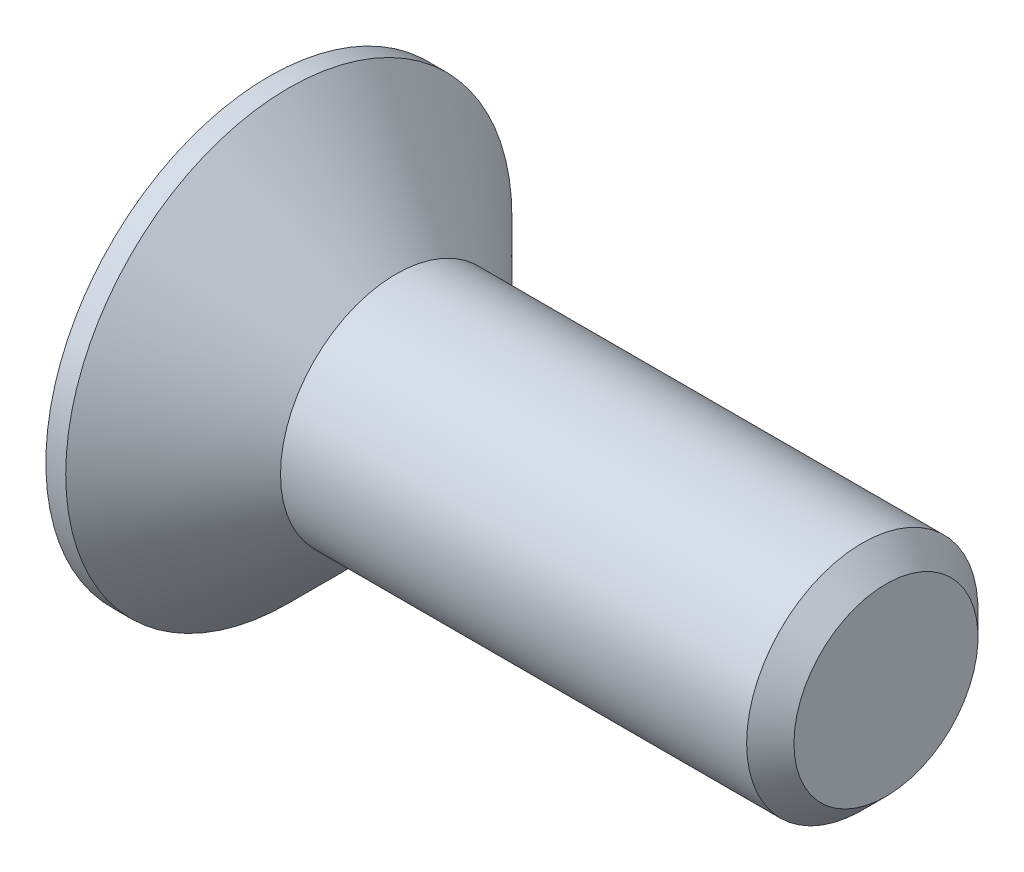
ISO-10303-21;
HEADER;
FILE_DESCRIPTION(('STEP AP214'),'2;1');
FILE_NAME('part.step','',(''),(''),'','','');
FILE_SCHEMA(('AUTOMOTIVE_DESIGN { 1 0 10303 214 1 1 1 1 }'));
ENDSEC;
DATA;
#1=APPLICATION_CONTEXT('core data for automotive mechanical design processes');
#2=APPLICATION_PROTOCOL_DEFINITION('international standard','automotive_design',2000,#1);
#3=PRODUCT_CONTEXT('',#1,'mechanical');
#4=PRODUCT('Part','Part','',(#3));
#5=PRODUCT_RELATED_PRODUCT_CATEGORY('part','',(#4));
#6=PRODUCT_DEFINITION_FORMATION('','',#4);
#7=PRODUCT_DEFINITION_CONTEXT('part definition',#1,'design');
#8=PRODUCT_DEFINITION('design','',#6,#7);
#9=PRODUCT_DEFINITION_SHAPE('','',#8);
#10=(LENGTH_UNIT() NAMED_UNIT(*) SI_UNIT(.MILLI.,.METRE.));
#11=(NAMED_UNIT(*) PLANE_ANGLE_UNIT() SI_UNIT($,.RADIAN.));
#12=(NAMED_UNIT(*) SI_UNIT($,.STERADIAN.) SOLID_ANGLE_UNIT());
#13=UNCERTAINTY_MEASURE_WITH_UNIT(LENGTH_MEASURE(1.E-05),#10,'distance_accuracy_value','');
#14=(GEOMETRIC_REPRESENTATION_CONTEXT(3) GLOBAL_UNCERTAINTY_ASSIGNED_CONTEXT((#13)) GLOBAL_UNIT_ASSIGNED_CONTEXT((#10,
#11,#12)) REPRESENTATION_CONTEXT('',''));
#15=CARTESIAN_POINT('',(0.,0.,0.));
#16=DIRECTION('',(0.,0.,1.));
#17=DIRECTION('',(1.,0.,0.));
#18=AXIS2_PLACEMENT_3D('',#15,#16,#17);
#19=CARTESIAN_POINT('',(3.583333333,0.,0.));
#20=CARTESIAN_POINT('',(2.242,0.,2.323257483));
#21=(BOUNDED_CURVE() B_SPLINE_CURVE(1,(#19,#20),.UNSPECIFIED.,.F.,
.F.) B_SPLINE_CURVE_WITH_KNOTS((2,2),(0.,1.),
.UNSPECIFIED.) CURVE() GEOMETRIC_REPRESENTATION_ITEM() RATIONAL_B_SPLINE_CURVE((1.,1.)) REPRESENTATION_ITEM(''));
#22=CARTESIAN_POINT('',(1002.242,0.,0.));
#23=DIRECTION('',(-1.,0.,0.));
#24=AXIS1_PLACEMENT('',#22,#23);
#25=SURFACE_OF_REVOLUTION('',#21,#24);
#26=CARTESIAN_POINT('',(3.583333333,0.,0.));
#27=VERTEX_POINT('',#26);
#28=VERTEX_LOOP('',#27);
#29=FACE_BOUND('',#28,.T.);
#30=CARTESIAN_POINT('',(2.25000000001408,-2.,-1.15470053788809));
#31=CARTESIAN_POINT('',(2.26432344829961,-2.,-1.10507931783836));
#32=CARTESIAN_POINT('',(2.27801128916447,-2.,-1.05526823648446));
#33=CARTESIAN_POINT('',(2.30395309354503,-2.,-0.955218692584601));
#34=CARTESIAN_POINT('',(2.31620552534249,-2.,-0.904979833768191));
#35=CARTESIAN_POINT('',(2.33908619863966,-2.,-0.804117092857361));
#36=CARTESIAN_POINT('',(2.34971395719255,-2.,-0.753493100955424));
#37=CARTESIAN_POINT('',(2.37398983220845,-2.,-0.626639541965093));
#38=CARTESIAN_POINT('',(2.38651369366398,-2.,-0.550189309279965));
#39=CARTESIAN_POINT('',(2.40693114488454,-2.,-0.396671573867792));
#40=CARTESIAN_POINT('',(2.41482483334796,-2.,-0.319604084333909));
#41=CARTESIAN_POINT('',(2.42731567432861,-2.,-0.139619688318727));
#42=CARTESIAN_POINT('',(2.42996760586008,-2.,-0.0365584858174828));
#43=CARTESIAN_POINT('',(2.42602464612431,-2.,0.169407105575029));
#44=CARTESIAN_POINT('',(2.41942694102321,-2.,0.272311437209823));
#45=CARTESIAN_POINT('',(2.39765520861198,-2.,0.477116468442624));
#46=CARTESIAN_POINT('',(2.38248644832592,-2.,0.579017745340765));
#47=CARTESIAN_POINT('',(2.34485695260433,-2.,0.781457902208293));
#48=CARTESIAN_POINT('',(2.32239494499451,-2.,0.881996541300711));
#49=CARTESIAN_POINT('',(2.28964320945093,-2.,1.01073167966331));
#50=CARTESIAN_POINT('',(2.28202706130478,-2.,1.03963527361655));
#51=CARTESIAN_POINT('',(2.26634475276974,-2.,1.09727927854886));
#52=CARTESIAN_POINT('',(2.2582791990134,-2.,1.12601985444693));
#53=CARTESIAN_POINT('',(2.24999999997311,-2.,1.15470053803001));
#54=B_SPLINE_CURVE_WITH_KNOTS('',3,(#30,#31,#32,#33,#34,#35,#36,#37,#38,#39,#40,#41,#42,#43,#44,
#45,#46,#47,#48,#49,#50,#51,#52,#53),.UNSPECIFIED.,.F.,.F.,(4,2,2,2,2,2,2,2,2,2,2,4),(0.,
0.154946742254461,0.310057349772936,0.465213975848986,0.697487987858764,0.929757048454456,
1.23861321343774,1.54756335600883,1.85632385088139,2.16513823236429,2.25480717500282,
2.34435787937689),.UNSPECIFIED.);
#55=CARTESIAN_POINT('',(2.24999999977368,-1.99999999998959,-1.15470053800601));
#56=VERTEX_POINT('',#55);
#57=CARTESIAN_POINT('',(2.2500000000014,-1.99999999992813,1.1547005380565));
#58=VERTEX_POINT('',#57);
#59=EDGE_CURVE('E81',#56,#58,#54,.T.);
#60=ORIENTED_EDGE('',*,*,#59,.T.);
#61=CARTESIAN_POINT('',(2.25000000002969,-1.99999999985627,1.15470053808298));
#62=CARTESIAN_POINT('',(2.26432344831573,-1.9570267627328,1.17951114811751));
#63=CARTESIAN_POINT('',(2.27801128918121,-1.91388910089675,1.20441668880415));
#64=CARTESIAN_POINT('',(2.30395309356313,-1.82724365425529,1.25444146077354));
#65=CARTESIAN_POINT('',(2.31620552536131,-1.7837355262696,1.27956089019152));
#66=CARTESIAN_POINT('',(2.33908619865998,-1.69638583035843,1.32999226066658));
#67=CARTESIAN_POINT('',(2.34971395721362,-1.65254416733686,1.35530425662741));
#68=CARTESIAN_POINT('',(2.37398983223147,-1.54268576270728,1.41873103614714));
#69=CARTESIAN_POINT('',(2.38651369368828,-1.47647791908678,1.45695615250445));
#70=CARTESIAN_POINT('',(2.4069311449115,-1.34352766030848,1.53371502024019));
#71=CARTESIAN_POINT('',(2.4148248333763,-1.2767852565763,1.57224876502205));
#72=CARTESIAN_POINT('',(2.42731567436014,-1.12091419736822,1.66224096306308));
#73=CARTESIAN_POINT('',(2.42996760589371,-1.03166057787339,1.71377156433227));
#74=CARTESIAN_POINT('',(2.42602464616254,-0.853289143453434,1.81675436006574));
#75=CARTESIAN_POINT('',(2.41942694106395,-0.764171378113874,1.86820652590177));
#76=CARTESIAN_POINT('',(2.3976552086579,-0.586805018274011,1.97060904155555));
#77=CARTESIAN_POINT('',(2.38248644837448,-0.49855592381713,2.02155968002336));
#78=CARTESIAN_POINT('',(2.34485695265813,-0.323237605253407,2.12277975849441));
#79=CARTESIAN_POINT('',(2.3223949450509,-0.236168589752139,2.17304907805917));
#80=CARTESIAN_POINT('',(2.28964320948302,-0.124680689495186,2.23741664731851));
#81=CARTESIAN_POINT('',(2.28202706130817,-0.0996494427816671,2.25186844435448));
#82=CARTESIAN_POINT('',(2.26634475271244,-0.049728269956742,2.28069044693871));
#83=CARTESIAN_POINT('',(2.25827919892413,-0.0248382010212988,2.29506073494646));
#84=CARTESIAN_POINT('',(2.24999999985037,-3.5251500857346E-10,2.30940107679648));
#85=B_SPLINE_CURVE_WITH_KNOTS('',3,(#61,#62,#63,#64,#65,#66,#67,#68,#69,#70,#71,#72,#73,#74,#75,
#76,#77,#78,#79,#80,#81,#82,#83,#84),.UNSPECIFIED.,.F.,.F.,(4,2,2,2,2,2,2,2,2,2,2,4),(0.,
0.154946742252922,0.310057349769858,0.46521397584437,0.697487987850844,0.929757048443223,
1.23861321341348,1.54756335597147,1.85632385083215,2.16513823230331,2.25480717527432,
2.34435787998),.UNSPECIFIED.);
#86=CARTESIAN_POINT('',(2.24999999969857,-1.02892596558302E-10,2.3094010770594));
#87=VERTEX_POINT('',#86);
#88=EDGE_CURVE('E76',#58,#87,#85,.T.);
#89=ORIENTED_EDGE('',*,*,#88,.T.);
#90=CARTESIAN_POINT('',(2.24999999980252,2.08951689463622E-10,2.30940107687936));
#91=CARTESIAN_POINT('',(2.26432344809757,0.0429732373375767,2.28459046684186));
#92=CARTESIAN_POINT('',(2.27801128897231,0.0861108991787889,2.25968492615224));
#93=CARTESIAN_POINT('',(2.30395309337323,0.172756345830712,2.2096601541768));
#94=CARTESIAN_POINT('',(2.31620552518114,0.216264473821696,2.18454072475577));
#95=CARTESIAN_POINT('',(2.33908619849962,0.303614169743624,2.1341093542745));
#96=CARTESIAN_POINT('',(2.34971395706336,0.347455832770666,2.10879735831051));
#97=CARTESIAN_POINT('',(2.37398983210698,0.457314237415103,2.0453705787822));
#98=CARTESIAN_POINT('',(2.38651369357959,0.52352208104514,2.00714546241939));
#99=CARTESIAN_POINT('',(2.40693114483439,0.656472339843252,1.9303865946722));
#100=CARTESIAN_POINT('',(2.41482483331495,0.723214743585711,1.89185284988442));
#101=CARTESIAN_POINT('',(2.42731567433258,0.879085802794933,1.80186065184272));
#102=CARTESIAN_POINT('',(2.42996760588624,0.968339422280815,1.7503300505787));
#103=CARTESIAN_POINT('',(2.42602464619657,1.14671085668448,1.64734725485464));
#104=CARTESIAN_POINT('',(2.41942694111939,1.2358286220167,1.59589508902284));
#105=CARTESIAN_POINT('',(2.39765520875542,1.41319498184278,1.49349257337702));
#106=CARTESIAN_POINT('',(2.38248644849272,1.50144407629322,1.44254193491293));
#107=CARTESIAN_POINT('',(2.34485695281573,1.67676239484488,1.34132185644884));
#108=CARTESIAN_POINT('',(2.32239494522715,1.76383141034053,1.29105253688733));
#109=CARTESIAN_POINT('',(2.28964320968012,1.87531931059632,1.22668496762866));
#110=CARTESIAN_POINT('',(2.2820270615084,1.90035055731416,1.21223317059019));
#111=CARTESIAN_POINT('',(2.26634475291849,1.95027173014772,1.18341116800098));
#112=CARTESIAN_POINT('',(2.25827919913286,1.97516179908749,1.16904087999074));
#113=CARTESIAN_POINT('',(2.25000000006159,1.99999999976056,1.15470053813824));
#114=B_SPLINE_CURVE_WITH_KNOTS('',3,(#90,#91,#92,#93,#94,#95,#96,#97,#98,#99,#100,#101,#102,
#103,#104,#105,#106,#107,#108,#109,#110,#111,#112,#113),.UNSPECIFIED.,.F.,.F.,(4,2,2,2,2,2,2,2,
2,2,2,4),(0.,0.154946742277567,0.310057349819247,0.465213975918541,0.697487987965309,
0.929757048597924,1.23861321353893,1.54756335606742,1.85632385089675,2.16513823233652,
2.25480717531961,2.3443578800375),.UNSPECIFIED.);
#115=CARTESIAN_POINT('',(2.2500000000014,1.99999999988028,1.15470053813938));
#116=VERTEX_POINT('',#115);
#117=EDGE_CURVE('E78',#87,#116,#114,.T.);
#118=ORIENTED_EDGE('',*,*,#117,.T.);
#119=CARTESIAN_POINT('',(2.24999999994121,2.,1.15470053814052));
#120=CARTESIAN_POINT('',(2.26432344822953,2.,1.10507931808887));
#121=CARTESIAN_POINT('',(2.27801128909737,2.,1.05526823673306));
#122=CARTESIAN_POINT('',(2.30395309348409,2.,0.955218692829336));
#123=CARTESIAN_POINT('',(2.31620552528472,2.,0.904979834010979));
#124=CARTESIAN_POINT('',(2.33908619858825,2.,0.804117093096167));
#125=CARTESIAN_POINT('',(2.34971395714434,2.,0.753493101192196));
#126=CARTESIAN_POINT('',(2.37398983216849,2.,0.626639542196347));
#127=CARTESIAN_POINT('',(2.38651369362917,2.,0.550189309507689));
#128=CARTESIAN_POINT('',(2.40693114485987,2.,0.396671574088161));
#129=CARTESIAN_POINT('',(2.41482483332828,2.,0.319604084550453));
#130=CARTESIAN_POINT('',(2.42731567431977,2.,0.139619688534822));
#131=CARTESIAN_POINT('',(2.42996760585776,2.,0.0365584860368869));
#132=CARTESIAN_POINT('',(2.42602464613532,2.,-0.169407105349605));
#133=CARTESIAN_POINT('',(2.41942694104102,2.,-0.272311436981689));
#134=CARTESIAN_POINT('',(2.39765520864322,2.,-0.477116468209387));
#135=CARTESIAN_POINT('',(2.3824864483638,2.,-0.579017745105137));
#136=CARTESIAN_POINT('',(2.34485695265486,2.,-0.781457901968187));
#137=CARTESIAN_POINT('',(2.32239494505103,2.,-0.881996541058518));
#138=CARTESIAN_POINT('',(2.2896432095149,2.,-1.01073167941769));
#139=CARTESIAN_POINT('',(2.28202706137057,2.,-1.03963527336954));
#140=CARTESIAN_POINT('',(2.2663447528391,2.,-1.09727927829912));
#141=CARTESIAN_POINT('',(2.25827919908453,2.,-1.12601985419584));
#142=CARTESIAN_POINT('',(2.25000000004598,2.,-1.15470053777757));
#143=B_SPLINE_CURVE_WITH_KNOTS('',3,(#119,#120,#121,#122,#123,#124,#125,#126,#127,#128,#129,
#130,#131,#132,#133,#134,#135,#136,#137,#138,#139,#140,#141,#142),.UNSPECIFIED.,.F.,.F.,(4,2,2,
2,2,2,2,2,2,2,2,4),(0.,0.15494674226236,0.310057349788767,0.465213975872766,0.697487987895502,
0.929757048504132,1.23861321347806,1.54756335603971,1.85632385090221,2.16513823237502,
2.25480717500815,2.34435787937689),.UNSPECIFIED.);
#144=CARTESIAN_POINT('',(2.2500000000014,2.00000000003744,-1.15470053786717));
#145=VERTEX_POINT('',#144);
#146=EDGE_CURVE('E394',#116,#145,#143,.T.);
#147=ORIENTED_EDGE('',*,*,#146,.T.);
#148=CARTESIAN_POINT('',(2.24999999995681,2.00000000007488,-1.15470053795677));
#149=CARTESIAN_POINT('',(2.26432344824571,1.9570267629496,-1.17951114799233));
#150=CARTESIAN_POINT('',(2.27801128911418,1.91388910111177,-1.20441668868001));
#151=CARTESIAN_POINT('',(2.30395309350229,1.82724365446668,-1.2544414606515));
#152=CARTESIAN_POINT('',(2.31620552530367,1.78373552647917,-1.27956089007053));
#153=CARTESIAN_POINT('',(2.33908619860879,1.69638583056428,-1.32999226054773));
#154=CARTESIAN_POINT('',(2.34971395716569,1.65254416754082,-1.35530425650966));
#155=CARTESIAN_POINT('',(2.37398983219173,1.54268576290653,-1.4187310360321));
#156=CARTESIAN_POINT('',(2.38651369365351,1.47647791928317,-1.45695615239106));
#157=CARTESIAN_POINT('',(2.40693114488676,1.34352766049894,-1.53371502013023));
#158=CARTESIAN_POINT('',(2.41482483335661,1.27678525676368,-1.57224876491386));
#159=CARTESIAN_POINT('',(2.42731567435131,1.12091419755568,-1.66224096295485));
#160=CARTESIAN_POINT('',(2.42996760589135,1.03166057806394,-1.71377156422226));
#161=CARTESIAN_POINT('',(2.42602464617351,0.853289143649675,-1.81675435995244));
#162=CARTESIAN_POINT('',(2.41942694108179,0.764171378312703,-1.86820652578698));
#163=CARTESIAN_POINT('',(2.39765520868924,0.586805018477285,-1.97060904143819));
#164=CARTESIAN_POINT('',(2.38248644841243,0.498555924022264,-2.02155967990492));
#165=CARTESIAN_POINT('',(2.34485695270876,0.323237605461943,-2.12277975837401));
#166=CARTESIAN_POINT('',(2.32239494510761,0.23616858996222,-2.17304907793788));
#167=CARTESIAN_POINT('',(2.28964320951641,0.124680689603891,-2.23741664725575));
#168=CARTESIAN_POINT('',(2.2820270613107,0.0996494427879329,-2.25186844435086));
#169=CARTESIAN_POINT('',(2.26634475264967,0.049728269759257,-2.28069044705272));
#170=CARTESIAN_POINT('',(2.25827919882692,0.0248382007224999,-2.29506073511897));
#171=CARTESIAN_POINT('',(2.24999999971714,-4.71897342993301E-11,-2.30940107702725));
#172=B_SPLINE_CURVE_WITH_KNOTS('',3,(#148,#149,#150,#151,#152,#153,#154,#155,#156,#157,#158,
#159,#160,#161,#162,#163,#164,#165,#166,#167,#168,#169,#170,#171),.UNSPECIFIED.,.F.,.F.,(4,2,2,
2,2,2,2,2,2,2,2,4),(0.,0.154946742261307,0.310057349786664,0.465213975869611,0.697487987888269,
0.929757048492815,1.2386132134529,1.54756335600062,1.85632385085196,2.16513823231391,
2.25480717565162,2.34435788072308),.UNSPECIFIED.);
#173=CARTESIAN_POINT('',(2.24999999973287,-9.47332157419396E-10,-2.309401077));
#174=VERTEX_POINT('',#173);
#175=EDGE_CURVE('E387',#145,#174,#172,.T.);
#176=ORIENTED_EDGE('',*,*,#175,.T.);
#177=CARTESIAN_POINT('',(2.24999999993575,-6.08655975065312E-10,-2.30940107664859));
#178=CARTESIAN_POINT('',(2.26432344822551,-0.0429732377342242,-2.28459046661286));
#179=CARTESIAN_POINT('',(2.27801128909483,-0.0861108995723678,-2.25968492592501));
#180=CARTESIAN_POINT('',(2.30395309348462,-0.172756346218081,-2.20966015395316));
#181=CARTESIAN_POINT('',(2.31620552528684,-0.216264474205925,-2.18454072453393));
#182=CARTESIAN_POINT('',(2.33908619859368,-0.303614170121474,-2.13410935405635));
#183=CARTESIAN_POINT('',(2.34971395715147,-0.347455833145278,-2.10879735809423));
#184=CARTESIAN_POINT('',(2.37398983217997,-0.457314237781029,-2.04537057857094));
#185=CARTESIAN_POINT('',(2.38651369364335,-0.523522081405527,-2.00714546221132));
#186=CARTESIAN_POINT('',(2.40693114487964,-0.656472340192129,-1.93038659447078));
#187=CARTESIAN_POINT('',(2.41482483335094,-0.723214743928618,-1.89185284968644));
#188=CARTESIAN_POINT('',(2.42731567434874,-0.879085803137284,-1.80186065164507));
#189=CARTESIAN_POINT('',(2.42996760589063,-0.968339422628472,-1.75033005037798));
#190=CARTESIAN_POINT('',(2.42602464617662,-1.14671085704181,-1.64734725464833));
#191=CARTESIAN_POINT('',(2.41942694108686,-1.2358286223784,-1.59589508881402));
#192=CARTESIAN_POINT('',(2.39765520869815,-1.41319498221257,-1.49349257316353));
#193=CARTESIAN_POINT('',(2.38248644842327,-1.50144407666673,-1.44254193469729));
#194=CARTESIAN_POINT('',(2.34485695272326,-1.67676239522536,-1.34132185622917));
#195=CARTESIAN_POINT('',(2.32239494512383,-1.76383141072426,-1.29105253666578));
#196=CARTESIAN_POINT('',(2.28964320957205,-1.87531931095487,-1.22668496742165));
#197=CARTESIAN_POINT('',(2.28202706140653,-1.90035055764452,-1.21223317039946));
#198=CARTESIAN_POINT('',(2.26634475283022,-1.95027173042199,-1.18341116784263));
#199=CARTESIAN_POINT('',(2.258279199052,-1.97516179933385,-1.1690408798485));
#200=CARTESIAN_POINT('',(2.24999999998872,-1.99999999997917,-1.15470053801203));
#201=B_SPLINE_CURVE_WITH_KNOTS('',3,(#177,#178,#179,#180,#181,#182,#183,#184,#185,#186,#187,
#188,#189,#190,#191,#192,#193,#194,#195,#196,#197,#198,#199,#200),.UNSPECIFIED.,.F.,.F.,(4,2,2,
2,2,2,2,2,2,2,2,4),(0.,0.154946742262994,0.310057349790044,0.465213975874689,0.697487987898021,
0.929757048507234,1.23861321346559,1.5475633560116,1.85632385085915,2.1651382323171,
2.254807175201,2.34435787981987),.UNSPECIFIED.);
#202=EDGE_CURVE('E21',#174,#56,#201,.T.);
#203=ORIENTED_EDGE('',*,*,#202,.T.);
#204=EDGE_LOOP('',(#60,#89,#118,#147,#176,#203));
#205=FACE_BOUND('',#204,.T.);
#206=ADVANCED_FACE('F17',(#29,#205),#25,.F.);
#207=CARTESIAN_POINT('',(0.,-2.,-1.154700538));
#208=DIRECTION('',(0.,-0.500000000201594,-0.866025403668048));
#209=DIRECTION('',(0.,0.866025403668048,-0.500000000201594));
#210=AXIS2_PLACEMENT_3D('',#207,#208,#209);
#211=PLANE('',#210);
#212=DIRECTION('',(0.,0.866025403668048,-0.500000000201594));
#213=VECTOR('',#212,1.);
#214=CARTESIAN_POINT('',(0.,-2.0000000051475,-1.15470053502809));
#215=LINE('',#214,#213);
#216=CARTESIAN_POINT('',(0.,-2.,-1.154700538));
#217=VERTEX_POINT('',#216);
#218=CARTESIAN_POINT('',(0.,0.,-2.309401077));
#219=VERTEX_POINT('',#218);
#220=EDGE_CURVE('E431',#217,#219,#215,.T.);
#221=ORIENTED_EDGE('',*,*,#220,.F.);
#222=DIRECTION('',(1.,0.,0.));
#223=VECTOR('',#222,1.);
#224=CARTESIAN_POINT('',(0.,-2.,-1.154700538));
#225=LINE('',#224,#223);
#226=EDGE_CURVE('E436',#217,#56,#225,.T.);
#227=ORIENTED_EDGE('',*,*,#226,.T.);
#228=ORIENTED_EDGE('',*,*,#202,.F.);
#229=DIRECTION('',(1.,0.,0.));
#230=VECTOR('',#229,1.);
#231=CARTESIAN_POINT('',(0.,0.,-2.309401077));
#232=LINE('',#231,#230);
#233=EDGE_CURVE('E390',#174,#219,#232,.F.);
#234=ORIENTED_EDGE('',*,*,#233,.T.);
#235=EDGE_LOOP('',(#221,#227,#228,#234));
#236=FACE_BOUND('',#235,.T.);
#237=ADVANCED_FACE('F271',(#236),#211,.F.);
#238=CARTESIAN_POINT('',(0.,0.,-2.309401077));
#239=DIRECTION('',(0.,0.500000000201594,-0.866025403668048));
#240=DIRECTION('',(0.,0.866025403668048,0.500000000201594));
#241=AXIS2_PLACEMENT_3D('',#238,#239,#240);
#242=PLANE('',#241);
#243=DIRECTION('',(0.,0.866025403668048,0.500000000201594));
#244=VECTOR('',#243,1.);
#245=CARTESIAN_POINT('',(0.,-4.13700323997901E-10,-2.30940107723885));
#246=LINE('',#245,#244);
#247=CARTESIAN_POINT('',(0.,2.,-1.154700538));
#248=VERTEX_POINT('',#247);
#249=EDGE_CURVE('E421',#219,#248,#246,.T.);
#250=ORIENTED_EDGE('',*,*,#249,.F.);
#251=ORIENTED_EDGE('',*,*,#233,.F.);
#252=ORIENTED_EDGE('',*,*,#175,.F.);
#253=DIRECTION('',(1.,0.,0.));
#254=VECTOR('',#253,1.);
#255=CARTESIAN_POINT('',(0.,2.,-1.154700538));
#256=LINE('',#255,#254);
#257=EDGE_CURVE('E92',#145,#248,#256,.F.);
#258=ORIENTED_EDGE('',*,*,#257,.T.);
#259=EDGE_LOOP('',(#250,#251,#252,#258));
#260=FACE_BOUND('',#259,.T.);
#261=ADVANCED_FACE('F283',(#260),#242,.F.);
#262=CARTESIAN_POINT('',(0.,2.,-1.154700538));
#263=DIRECTION('',(0.,1.,0.));
#264=DIRECTION('',(0.,0.,1.));
#265=AXIS2_PLACEMENT_3D('',#262,#263,#264);
#266=PLANE('',#265);
#267=DIRECTION('',(0.,0.,1.));
#268=VECTOR('',#267,1.);
#269=CARTESIAN_POINT('',(0.,2.,-5.85442));
#270=LINE('',#269,#268);
#271=CARTESIAN_POINT('',(0.,2.,1.154700538));
#272=VERTEX_POINT('',#271);
#273=EDGE_CURVE('E424',#248,#272,#270,.T.);
#274=ORIENTED_EDGE('',*,*,#273,.F.);
#275=ORIENTED_EDGE('',*,*,#257,.F.);
#276=ORIENTED_EDGE('',*,*,#146,.F.);
#277=DIRECTION('',(1.,0.,0.));
#278=VECTOR('',#277,1.);
#279=CARTESIAN_POINT('',(0.,2.,1.154700538));
#280=LINE('',#279,#278);
#281=EDGE_CURVE('E85',#116,#272,#280,.F.);
#282=ORIENTED_EDGE('',*,*,#281,.T.);
#283=EDGE_LOOP('',(#274,#275,#276,#282));
#284=FACE_BOUND('',#283,.T.);
#285=ADVANCED_FACE('F292',(#284),#266,.F.);
#286=CARTESIAN_POINT('',(0.,2.,1.154700538));
#287=DIRECTION('',(0.,0.500000000201594,0.866025403668048));
#288=DIRECTION('',(0.,-0.866025403668048,0.500000000201594));
#289=AXIS2_PLACEMENT_3D('',#286,#287,#288);
#290=PLANE('',#289);
#291=DIRECTION('',(0.,-0.866025403668048,0.500000000201594));
#292=VECTOR('',#291,1.);
#293=CARTESIAN_POINT('',(0.,2.0000000051475,1.15470053502809));
#294=LINE('',#293,#292);
#295=CARTESIAN_POINT('',(0.,0.,2.309401077));
#296=VERTEX_POINT('',#295);
#297=EDGE_CURVE('E426',#272,#296,#294,.T.);
#298=ORIENTED_EDGE('',*,*,#297,.F.);
#299=ORIENTED_EDGE('',*,*,#281,.F.);
#300=ORIENTED_EDGE('',*,*,#117,.F.);
#301=DIRECTION('',(1.,0.,0.));
#302=VECTOR('',#301,1.);
#303=CARTESIAN_POINT('',(0.,0.,2.309401077));
#304=LINE('',#303,#302);
#305=EDGE_CURVE('E84',#87,#296,#304,.F.);
#306=ORIENTED_EDGE('',*,*,#305,.T.);
#307=EDGE_LOOP('',(#298,#299,#300,#306));
#308=FACE_BOUND('',#307,.T.);
#309=ADVANCED_FACE('F90',(#308),#290,.F.);
#310=CARTESIAN_POINT('',(0.,0.,2.309401077));
#311=DIRECTION('',(0.,-0.500000000201594,0.866025403668048));
#312=DIRECTION('',(0.,-0.866025403668048,-0.500000000201594));
#313=AXIS2_PLACEMENT_3D('',#310,#311,#312);
#314=PLANE('',#313);
#315=DIRECTION('',(0.,-0.866025403668048,-0.500000000201594));
#316=VECTOR('',#315,1.);
#317=CARTESIAN_POINT('',(0.,4.13700323997901E-10,2.30940107723885));
#318=LINE('',#317,#316);
#319=CARTESIAN_POINT('',(0.,-2.,1.154700538));
#320=VERTEX_POINT('',#319);
#321=EDGE_CURVE('E96',#296,#320,#318,.T.);
#322=ORIENTED_EDGE('',*,*,#321,.F.);
#323=ORIENTED_EDGE('',*,*,#305,.F.);
#324=ORIENTED_EDGE('',*,*,#88,.F.);
#325=DIRECTION('',(1.,0.,0.));
#326=VECTOR('',#325,1.);
#327=CARTESIAN_POINT('',(0.,-2.,1.154700538));
#328=LINE('',#327,#326);
#329=EDGE_CURVE('E43',#58,#320,#328,.F.);
#330=ORIENTED_EDGE('',*,*,#329,.T.);
#331=EDGE_LOOP('',(#322,#323,#324,#330));
#332=FACE_BOUND('',#331,.T.);
#333=ADVANCED_FACE('F94',(#332),#314,.F.);
#334=CARTESIAN_POINT('',(0.,-2.,1.154700538));
#335=DIRECTION('',(0.,-1.,0.));
#336=DIRECTION('',(0.,0.,-1.));
#337=AXIS2_PLACEMENT_3D('',#334,#335,#336);
#338=PLANE('',#337);
#339=DIRECTION('',(0.,0.,1.));
#340=VECTOR('',#339,1.);
#341=CARTESIAN_POINT('',(0.,-2.,-5.85442));
#342=LINE('',#341,#340);
#343=EDGE_CURVE('E143',#320,#217,#342,.F.);
#344=ORIENTED_EDGE('',*,*,#343,.F.);
#345=ORIENTED_EDGE('',*,*,#329,.F.);
#346=ORIENTED_EDGE('',*,*,#59,.F.);
#347=ORIENTED_EDGE('',*,*,#226,.F.);
#348=EDGE_LOOP('',(#344,#345,#346,#347));
#349=FACE_BOUND('',#348,.T.);
#350=ADVANCED_FACE('F123',(#349),#338,.F.);
#351=CARTESIAN_POINT('',(0.,5.85442,-5.85442));
#352=DIRECTION('',(-1.,0.,0.));
#353=DIRECTION('',(0.,-1.,0.));
#354=AXIS2_PLACEMENT_3D('',#351,#352,#353);
#355=PLANE('',#354);
#356=ORIENTED_EDGE('',*,*,#321,.T.);
#357=ORIENTED_EDGE('',*,*,#343,.T.);
#358=ORIENTED_EDGE('',*,*,#220,.T.);
#359=ORIENTED_EDGE('',*,*,#249,.T.);
#360=ORIENTED_EDGE('',*,*,#273,.T.);
#361=ORIENTED_EDGE('',*,*,#297,.T.);
#362=EDGE_LOOP('',(#356,#357,#358,#359,#360,#361));
#363=FACE_BOUND('',#362,.T.);
#364=CARTESIAN_POINT('',(0.,-5.785,-1.58203173214756E-09));
#365=CARTESIAN_POINT('',(0.,-5.78500328044489,0.172573830671069));
#366=CARTESIAN_POINT('',(0.,-5.77727599254287,0.3451046110101));
#367=CARTESIAN_POINT('',(0.,-5.74642843890485,0.688885798055075));
#368=CARTESIAN_POINT('',(0.,-5.72330152076249,0.860135619061979));
#369=CARTESIAN_POINT('',(0.,-5.66363500700208,1.18990772966046));
#370=CARTESIAN_POINT('',(0.,-5.62796105756351,1.34858767531721));
#371=CARTESIAN_POINT('',(0.,-5.54336913190935,1.66243902637398));
#372=CARTESIAN_POINT('',(0.,-5.49444669242575,1.81760923025831));
#373=CARTESIAN_POINT('',(0.,-5.38365313471015,2.12343684684962));
#374=CARTESIAN_POINT('',(0.,-5.32176864741523,2.27408941522516));
#375=CARTESIAN_POINT('',(0.,-5.18549693814534,2.5696973180808));
#376=CARTESIAN_POINT('',(0.,-5.11110511987056,2.7146505338638));
#377=CARTESIAN_POINT('',(0.,-4.95043792139131,2.99763899403248));
#378=CARTESIAN_POINT('',(0.,-4.86417344383522,3.13568042868541));
#379=CARTESIAN_POINT('',(0.,-4.68028859409405,3.40405537714368));
#380=CARTESIAN_POINT('',(0.,-4.58266404561238,3.53438602950907));
#381=CARTESIAN_POINT('',(0.,-4.37684812044259,3.78627253089598));
#382=CARTESIAN_POINT('',(0.,-4.2686638516283,3.90783418788828));
#383=CARTESIAN_POINT('',(0.,-4.04240057744258,4.14145820706095));
#384=CARTESIAN_POINT('',(0.,-3.92431793521034,4.25351704702606));
#385=CARTESIAN_POINT('',(0.,-3.67916211098052,4.46726222943432));
#386=CARTESIAN_POINT('',(0.,-3.55209113851269,4.56895110613889));
#387=CARTESIAN_POINT('',(0.,-3.28978749116939,4.76130059573224));
#388=CARTESIAN_POINT('',(0.,-3.15455181975295,4.85195712235243));
#389=CARTESIAN_POINT('',(0.,-2.87696718758244,5.02152648105667));
#390=CARTESIAN_POINT('',(0.,-2.73462049892427,5.10044303261514));
#391=CARTESIAN_POINT('',(0.,-2.44373207803575,5.24603291778767));
#392=CARTESIAN_POINT('',(0.,-2.29518807635678,5.31270171713263));
#393=CARTESIAN_POINT('',(0.,-1.99307064471614,5.43326204351889));
#394=CARTESIAN_POINT('',(0.,-1.83949922617805,5.48715861119288));
#395=CARTESIAN_POINT('',(0.,-1.5283042246926,5.58184314686862));
#396=CARTESIAN_POINT('',(0.,-1.37067914668566,5.62262620127193));
#397=CARTESIAN_POINT('',(0.,-1.05261981890344,5.69075181450919));
#398=CARTESIAN_POINT('',(0.,-0.89218677119323,5.71809998566826));
#399=CARTESIAN_POINT('',(0.,-0.569514173954355,5.75919631408598));
#400=CARTESIAN_POINT('',(0.,-0.407273838753178,5.77293830287987));
#401=CARTESIAN_POINT('',(0.,-0.0822119202987225,5.78670285468577));
#402=CARTESIAN_POINT('',(0.,0.0806096640497102,5.7867253918348));
#403=CARTESIAN_POINT('',(0.,0.405601977804602,5.7730539419035));
#404=CARTESIAN_POINT('',(0.,0.567772968608017,5.75936616764435));
#405=CARTESIAN_POINT('',(0.,0.890452883757796,5.71837217089581));
#406=CARTESIAN_POINT('',(0.,1.05096109130621,5.69106030584492));
#407=CARTESIAN_POINT('',(0.,1.36904587171844,5.62302234820076));
#408=CARTESIAN_POINT('',(0.,1.52662351892509,5.58230127808204));
#409=CARTESIAN_POINT('',(0.,1.83784827561336,5.48771360662022));
#410=CARTESIAN_POINT('',(0.,1.99149386952392,5.43384201840523));
#411=CARTESIAN_POINT('',(0.,2.29364364190222,5.31336675930723));
#412=CARTESIAN_POINT('',(0.,2.44214969822223,5.24676779793806));
#413=CARTESIAN_POINT('',(0.,2.73307601909202,5.1012725372221));
#414=CARTESIAN_POINT('',(0.,2.87549411893948,5.02237190934443));
#415=CARTESIAN_POINT('',(0.,3.15312461821345,4.85288282790739));
#416=CARTESIAN_POINT('',(0.,3.28833965778418,4.76229869894525));
#417=CARTESIAN_POINT('',(0.,3.55070310698901,4.57003188159295));
#418=CARTESIAN_POINT('',(0.,3.67784883863219,4.46834553881289));
#419=CARTESIAN_POINT('',(0.,3.92307542219314,4.2546614189251));
#420=CARTESIAN_POINT('',(0.,4.0411596015655,4.14266746038122));
#421=CARTESIAN_POINT('',(0.,4.26752848944698,3.90907782941992));
#422=CARTESIAN_POINT('',(0.,4.37580863019138,3.78747773034051));
#423=CARTESIAN_POINT('',(0.,4.58169957882671,3.5356327214256));
#424=CARTESIAN_POINT('',(0.,4.679314302586,3.4053910128267));
#425=CARTESIAN_POINT('',(0.,4.8632752361504,3.13707678623884));
#426=CARTESIAN_POINT('',(0.,4.94961545948446,2.99900016347688));
#427=CARTESIAN_POINT('',(0.,5.11032312515115,2.71611450512174));
#428=CARTESIAN_POINT('',(0.,5.18469486976706,2.57130791296861));
#429=CARTESIAN_POINT('',(0.,5.32096468968293,2.27596113502018));
#430=CARTESIAN_POINT('',(0.,5.38286473565358,2.12542185953098));
#431=CARTESIAN_POINT('',(0.,5.49375260559676,1.8197137790734));
#432=CARTESIAN_POINT('',(0.,5.54274262170803,1.66454576505803));
#433=CARTESIAN_POINT('',(0.,5.65137511356795,1.26205390787876));
#434=CARTESIAN_POINT('',(0.,5.70145726666543,1.0120842364692));
#435=CARTESIAN_POINT('',(0.,5.76824705161241,0.508041724405238));
#436=CARTESIAN_POINT('',(0.,5.78499517230459,0.253974239916593));
#437=CARTESIAN_POINT('',(0.,5.7850032803874,-0.172573832599928));
#438=CARTESIAN_POINT('',(0.,5.77727599242781,-0.345104612936573));
#439=CARTESIAN_POINT('',(0.,5.74642843867512,-0.688885799971157));
#440=CARTESIAN_POINT('',(0.,5.72330152047572,-0.860135620970059));
#441=CARTESIAN_POINT('',(0.,5.66363500660545,-1.18990773154828));
#442=CARTESIAN_POINT('',(0.,5.62796105711402,-1.34858767719305));
#443=CARTESIAN_POINT('',(0.,5.54336913135529,-1.66243902822147));
#444=CARTESIAN_POINT('',(0.,5.49444669182001,-1.81760923208941));
#445=CARTESIAN_POINT('',(0.,5.38365313400248,-2.1234368486438));
#446=CARTESIAN_POINT('',(0.,5.32176864665733,-2.27408941699879));
#447=CARTESIAN_POINT('',(0.,5.18549693728885,-2.56969731980915));
#448=CARTESIAN_POINT('',(0.,5.11110511896572,-2.71465053556744));
#449=CARTESIAN_POINT('',(0.,4.95043792039209,-2.99763899568264));
#450=CARTESIAN_POINT('',(0.,4.86417344278998,-3.13568043030682));
#451=CARTESIAN_POINT('',(0.,4.68028859295934,-3.40405537870382));
#452=CARTESIAN_POINT('',(0.,4.58266404443421,-3.53438603103667));
#453=CARTESIAN_POINT('',(0.,4.37684811918046,-3.78627253235498));
#454=CARTESIAN_POINT('',(0.,4.26866385032566,-3.9078341893112));
#455=CARTESIAN_POINT('',(0.,4.04240057606208,-4.14145820840843));
#456=CARTESIAN_POINT('',(0.,3.92431793379249,-4.25351704833417));
#457=CARTESIAN_POINT('',(0.,3.67916210949144,-4.4672622306607));
#458=CARTESIAN_POINT('',(0.,3.55209113698971,-4.56895110732292));
#459=CARTESIAN_POINT('',(0.,3.28978748958229,-4.76130059682883));
#460=CARTESIAN_POINT('',(0.,3.15455181813563,-4.85195712340394));
#461=CARTESIAN_POINT('',(0.,2.87696718590861,-5.02152648201566));
#462=CARTESIAN_POINT('',(0.,2.73462049722413,-5.10044303352668));
#463=CARTESIAN_POINT('',(0.,2.44373207628707,-5.24603291860224));
#464=CARTESIAN_POINT('',(0.,2.29518807458588,-5.31270171789769));
#465=CARTESIAN_POINT('',(0.,1.99307064290506,-5.43326204418324));
#466=CARTESIAN_POINT('',(0.,1.839499224349,-5.48715861180604));
#467=CARTESIAN_POINT('',(0.,1.528304222832,-5.58184314737805));
#468=CARTESIAN_POINT('',(0.,1.37067914481147,-5.62262620172882));
#469=CARTESIAN_POINT('',(0.,1.05261981700653,-5.69075181486006));
#470=CARTESIAN_POINT('',(0.,0.892186769287205,-5.71809998596565));
#471=CARTESIAN_POINT('',(0.,0.569514172034628,-5.75919631427581));
#472=CARTESIAN_POINT('',(0.,0.407273836828869,-5.77293830301562));
#473=CARTESIAN_POINT('',(0.,0.0822119183698245,-5.78670285471318));
#474=CARTESIAN_POINT('',(0.,-0.0806096659786148,-5.78672539180792));
#475=CARTESIAN_POINT('',(0.,-0.405601979728948,-5.7730539417683));
#476=CARTESIAN_POINT('',(0.,-0.5677729705278,-5.75936616745509));
#477=CARTESIAN_POINT('',(0.,-0.890452885663914,-5.71837217059899));
#478=CARTESIAN_POINT('',(0.,-1.05096109320322,-5.6910603054946));
#479=CARTESIAN_POINT('',(0.,-1.36904587359277,-5.62302234774441));
#480=CARTESIAN_POINT('',(0.,-1.52662352078586,-5.58230127757317));
#481=CARTESIAN_POINT('',(0.,-1.83784827744262,-5.4877136060076));
#482=CARTESIAN_POINT('',(0.,-1.99149387133523,-5.43384201774139));
#483=CARTESIAN_POINT('',(0.,-2.2936436436734,-5.31336675854265));
#484=CARTESIAN_POINT('',(0.,-2.44214969997123,-5.24676779712397));
#485=CARTESIAN_POINT('',(0.,-2.73307602079253,-5.10127253631104));
#486=CARTESIAN_POINT('',(0.,-2.87549412061366,-5.0223719083859));
#487=CARTESIAN_POINT('',(0.,-3.15312461983111,-4.85288282685633));
#488=CARTESIAN_POINT('',(0.,-3.28833965937162,-4.76229869784913));
#489=CARTESIAN_POINT('',(0.,-3.55070310851226,-4.57003188040946));
#490=CARTESIAN_POINT('',(0.,-3.67784884012146,-4.46834553758708));
#491=CARTESIAN_POINT('',(0.,-3.92307542361102,-4.25466141761771));
#492=CARTESIAN_POINT('',(0.,-4.04115960294598,-4.14266745903456));
#493=CARTESIAN_POINT('',(0.,-4.26752849074962,-3.90907782799783));
#494=CARTESIAN_POINT('',(0.,-4.37580863145357,-3.78747772888226));
#495=CARTESIAN_POINT('',(0.,-4.58169958000512,-3.53563271989855));
#496=CARTESIAN_POINT('',(0.,-4.67931430372106,-3.40539101126703));
#497=CARTESIAN_POINT('',(0.,-4.8632752371964,-3.1370767846173));
#498=CARTESIAN_POINT('',(0.,-4.94961546048471,-2.99900016182608));
#499=CARTESIAN_POINT('',(0.,-5.11032312605756,-2.71611450341638));
#500=CARTESIAN_POINT('',(0.,-5.18469487062538,-2.57130791123793));
#501=CARTESIAN_POINT('',(0.,-5.32096469044269,-2.27596113324393));
#502=CARTESIAN_POINT('',(0.,-5.38286473636292,-2.1254218577345));
#503=CARTESIAN_POINT('',(0.,-5.49375260620372,-1.81971377724085));
#504=CARTESIAN_POINT('',(0.,-5.54274262226306,-1.66454576320964));
#505=CARTESIAN_POINT('',(0.,-5.65137511382122,-1.26205390661544));
#506=CARTESIAN_POINT('',(0.,-5.70145726674964,-1.012084235833));
#507=CARTESIAN_POINT('',(0.,-5.76824705152783,-0.508041725044259));
#508=CARTESIAN_POINT('',(0.,-5.78499517221999,-0.25397424120366));
#509=CARTESIAN_POINT('',(0.,-5.785,-1.58203173214756E-09));
#510=B_SPLINE_CURVE_WITH_KNOTS('',3,(#364,#365,#366,#367,#368,#369,#370,#371,#372,#373,#374,
#375,#376,#377,#378,#379,#380,#381,#382,#383,#384,#385,#386,#387,#388,#389,#390,#391,#392,#393,
#394,#395,#396,#397,#398,#399,#400,#401,#402,#403,#404,#405,#406,#407,#408,#409,#410,#411,#412,
#413,#414,#415,#416,#417,#418,#419,#420,#421,#422,#423,#424,#425,#426,#427,#428,#429,#430,#431,
#432,#433,#434,#435,#436,#437,#438,#439,#440,#441,#442,#443,#444,#445,#446,#447,#448,#449,#450,
#451,#452,#453,#454,#455,#456,#457,#458,#459,#460,#461,#462,#463,#464,#465,#466,#467,#468,#469,
#470,#471,#472,#473,#474,#475,#476,#477,#478,#479,#480,#481,#482,#483,#484,#485,#486,#487,#488,
#489,#490,#491,#492,#493,#494,#495,#496,#497,#498,#499,#500,#501,#502,#503,#504,#505,#506,#507,
#508,#509),.UNSPECIFIED.,.T.,.F.,(4,2,2,2,2,2,2,2,2,2,2,2,2,2,2,2,2,2,2,2,2,2,2,2,2,2,2,2,2,2,2,
2,2,2,2,2,2,2,2,2,2,2,2,2,2,2,2,2,2,2,2,2,2,2,2,2,2,2,2,2,2,2,2,2,2,2,2,2,2,2,2,2,4),(0.,
0.517475897510089,1.03517548189536,1.52252996017203,2.01004882740664,2.49807301995122,
2.98627694933516,3.47403551630383,3.96197396758632,4.449586217349,4.93737841756844,
5.42505112165914,5.91290390844196,6.4006018023769,6.88847988583947,7.37616510362814,
7.86403284339928,8.35169660628292,8.8395813540959,9.3274670216368,9.81513170399178,
10.3029985257372,10.7906828223523,11.2785523441805,11.7662416878271,12.254103021372,
12.7417842906244,13.2296265711212,13.7172888472637,14.2051771716872,14.6928857588929,
15.1808522629086,15.6686429649399,16.1563565299233,16.643987227112,17.4064752181348,
18.1680364943054,18.6855123918165,19.2032119762008,19.6905664544772,20.1780853217116,
20.6661095142564,21.1543134436406,21.6420720106093,22.1300104618918,22.6176227116545,
23.1054149118739,23.5930876159646,24.0809404027474,24.5686382966823,25.0565163801449,
25.5442015979336,26.0320693377047,26.5197331005884,27.0076178484014,27.4955035159423,
27.9831681982972,28.4710350200427,28.9587193166578,29.446588838486,29.9342781821326,
30.4221395156775,30.9098207849299,31.3976630654263,31.8853253415685,32.3732136659923,
32.8609222531984,33.3488887572157,33.8366794592486,34.3243930242307,34.8120237214175,
35.574511710514,36.3360729847626),.UNSPECIFIED.);
#511=CARTESIAN_POINT('',(0.,-5.785,-1.58203173214756E-09));
#512=VERTEX_POINT('',#511);
#513=EDGE_CURVE('E134',#512,#512,#510,.T.);
#514=ORIENTED_EDGE('',*,*,#513,.T.);
#515=EDGE_LOOP('',(#514));
#516=FACE_BOUND('',#515,.T.);
#517=ADVANCED_FACE('F128',(#363,#516),#355,.T.);
#518=CARTESIAN_POINT('',(16.,-2.4151886,-2.4151886));
#519=DIRECTION('',(1.,0.,0.));
#520=DIRECTION('',(0.,1.,0.));
#521=AXIS2_PLACEMENT_3D('',#518,#519,#520);
#522=PLANE('',#521);
#523=CARTESIAN_POINT('',(16.,0.,0.));
#524=DIRECTION('',(-1.,0.,0.));
#525=DIRECTION('',(0.,0.,1.));
#526=AXIS2_PLACEMENT_3D('',#523,#524,#525);
#527=CIRCLE('',#526,2.38655);
#528=CARTESIAN_POINT('',(16.,0.,2.38655));
#529=VERTEX_POINT('',#528);
#530=EDGE_CURVE('E142',#529,#529,#527,.F.);
#531=ORIENTED_EDGE('',*,*,#530,.T.);
#532=EDGE_LOOP('',(#531));
#533=FACE_BOUND('',#532,.T.);
#534=ADVANCED_FACE('F19',(#533),#522,.T.);
#535=CARTESIAN_POINT('',(0.,5.785,0.));
#536=CARTESIAN_POINT('',(0.515,5.785,0.));
#537=(BOUNDED_CURVE() B_SPLINE_CURVE(1,(#535,#536),.UNSPECIFIED.,.F.,
.F.) B_SPLINE_CURVE_WITH_KNOTS((2,2),(0.,1.),
.UNSPECIFIED.) CURVE() GEOMETRIC_REPRESENTATION_ITEM() RATIONAL_B_SPLINE_CURVE((1.,1.)) REPRESENTATION_ITEM(''));
#538=CARTESIAN_POINT('',(0.2575,0.,0.));
#539=DIRECTION('',(1.,0.,0.));
#540=AXIS1_PLACEMENT('',#538,#539);
#541=SURFACE_OF_REVOLUTION('',#537,#540);
#542=CARTESIAN_POINT('',(0.515,0.,0.));
#543=DIRECTION('',(1.,0.,0.));
#544=DIRECTION('',(0.,1.,0.));
#545=AXIS2_PLACEMENT_3D('',#542,#543,#544);
#546=CIRCLE('',#545,5.785);
#547=CARTESIAN_POINT('',(0.515,5.785,0.));
#548=VERTEX_POINT('',#547);
#549=EDGE_CURVE('E174',#548,#548,#546,.F.);
#550=ORIENTED_EDGE('',*,*,#549,.T.);
#551=EDGE_LOOP('',(#550));
#552=FACE_BOUND('',#551,.T.);
#553=ORIENTED_EDGE('',*,*,#513,.F.);
#554=EDGE_LOOP('',(#553));
#555=FACE_BOUND('',#554,.T.);
#556=ADVANCED_FACE('F146',(#552,#555),#541,.T.);
#557=CARTESIAN_POINT('',(16.,0.,2.38655));
#558=CARTESIAN_POINT('',(15.38655,0.,3.));
#559=(BOUNDED_CURVE() B_SPLINE_CURVE(1,(#557,#558),.UNSPECIFIED.,.F.,
.F.) B_SPLINE_CURVE_WITH_KNOTS((2,2),(0.,0.999999999999907),
.UNSPECIFIED.) CURVE() GEOMETRIC_REPRESENTATION_ITEM() RATIONAL_B_SPLINE_CURVE((1.,1.)) REPRESENTATION_ITEM(''));
#560=CARTESIAN_POINT('',(1015.38655,0.,0.));
#561=DIRECTION('',(-1.,0.,0.));
#562=AXIS1_PLACEMENT('',#560,#561);
#563=SURFACE_OF_REVOLUTION('',#559,#562);
#564=ORIENTED_EDGE('',*,*,#530,.F.);
#565=EDGE_LOOP('',(#564));
#566=FACE_BOUND('',#565,.T.);
#567=CARTESIAN_POINT('',(15.3865500000001,0.,0.));
#568=DIRECTION('',(-1.,0.,0.));
#569=DIRECTION('',(0.,0.,1.));
#570=AXIS2_PLACEMENT_3D('',#567,#568,#569);
#571=CIRCLE('',#570,3.);
#572=CARTESIAN_POINT('',(15.38655,0.,3.));
#573=VERTEX_POINT('',#572);
#574=EDGE_CURVE('E11',#573,#573,#571,.F.);
#575=ORIENTED_EDGE('',*,*,#574,.T.);
#576=EDGE_LOOP('',(#575));
#577=FACE_BOUND('',#576,.T.);
#578=ADVANCED_FACE('F151',(#566,#577),#563,.T.);
#579=CARTESIAN_POINT('',(3.3,0.,3.));
#580=CARTESIAN_POINT('',(0.515,0.,5.785));
#581=(BOUNDED_CURVE() B_SPLINE_CURVE(1,(#579,#580),.UNSPECIFIED.,.F.,
.F.) B_SPLINE_CURVE_WITH_KNOTS((2,2),(0.,1.),
.UNSPECIFIED.) CURVE() GEOMETRIC_REPRESENTATION_ITEM() RATIONAL_B_SPLINE_CURVE((1.,1.)) REPRESENTATION_ITEM(''));
#582=CARTESIAN_POINT('',(1000.515,0.,0.));
#583=DIRECTION('',(-1.,0.,0.));
#584=AXIS1_PLACEMENT('',#582,#583);
#585=SURFACE_OF_REVOLUTION('',#581,#584);
#586=CARTESIAN_POINT('',(3.29999999999997,0.,0.));
#587=DIRECTION('',(-1.,0.,0.));
#588=DIRECTION('',(0.,0.,1.));
#589=AXIS2_PLACEMENT_3D('',#586,#587,#588);
#590=CIRCLE('',#589,3.);
#591=CARTESIAN_POINT('',(3.3,0.,3.));
#592=VERTEX_POINT('',#591);
#593=EDGE_CURVE('E34',#592,#592,#590,.T.);
#594=ORIENTED_EDGE('',*,*,#593,.T.);
#595=EDGE_LOOP('',(#594));
#596=FACE_BOUND('',#595,.T.);
#597=ORIENTED_EDGE('',*,*,#549,.F.);
#598=EDGE_LOOP('',(#597));
#599=FACE_BOUND('',#598,.T.);
#600=ADVANCED_FACE('F190',(#596,#599),#585,.T.);
#601=CARTESIAN_POINT('',(3.3,3.,0.));
#602=CARTESIAN_POINT('',(15.38655,3.,0.));
#603=(BOUNDED_CURVE() B_SPLINE_CURVE(1,(#601,#602),.UNSPECIFIED.,.F.,
.F.) B_SPLINE_CURVE_WITH_KNOTS((2,2),(0.,1.),
.UNSPECIFIED.) CURVE() GEOMETRIC_REPRESENTATION_ITEM() RATIONAL_B_SPLINE_CURVE((1.,1.)) REPRESENTATION_ITEM(''));
#604=CARTESIAN_POINT('',(10.9,0.,0.));
#605=DIRECTION('',(1.,0.,0.));
#606=AXIS1_PLACEMENT('',#604,#605);
#607=SURFACE_OF_REVOLUTION('',#603,#606);
#608=ORIENTED_EDGE('',*,*,#574,.F.);
#609=EDGE_LOOP('',(#608));
#610=FACE_BOUND('',#609,.T.);
#611=ORIENTED_EDGE('',*,*,#593,.F.);
#612=EDGE_LOOP('',(#611));
#613=FACE_BOUND('',#612,.T.);
#614=ADVANCED_FACE('F193',(#610,#613),#607,.T.);
#615=CLOSED_SHELL('',(#206,#237,#261,#285,#309,#333,#350,#517,#534,#556,#578,#600,#614));
#616=MANIFOLD_SOLID_BREP('B1',#615);
#617=ADVANCED_BREP_SHAPE_REPRESENTATION('',(#18,#616),#14);
#618=SHAPE_DEFINITION_REPRESENTATION(#9,#617);
ENDSEC;
END-ISO-10303-21;
